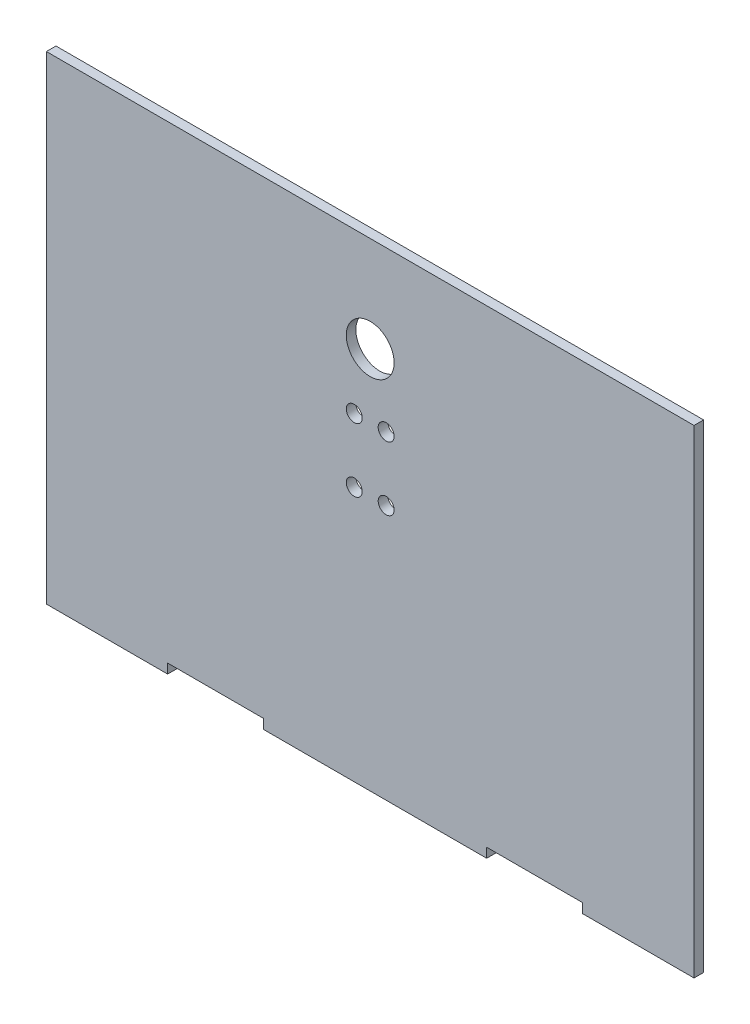
ISO-10303-21;
HEADER;
FILE_DESCRIPTION(('STEP AP214'),'2;1');
FILE_NAME('part.step','',(''),(''),'','','');
FILE_SCHEMA(('AUTOMOTIVE_DESIGN { 1 0 10303 214 1 1 1 1 }'));
ENDSEC;
DATA;
#1=APPLICATION_CONTEXT('core data for automotive mechanical design processes');
#2=APPLICATION_PROTOCOL_DEFINITION('international standard','automotive_design',2000,#1);
#3=PRODUCT_CONTEXT('',#1,'mechanical');
#4=PRODUCT('Part','Part','',(#3));
#5=PRODUCT_RELATED_PRODUCT_CATEGORY('part','',(#4));
#6=PRODUCT_DEFINITION_FORMATION('','',#4);
#7=PRODUCT_DEFINITION_CONTEXT('part definition',#1,'design');
#8=PRODUCT_DEFINITION('design','',#6,#7);
#9=PRODUCT_DEFINITION_SHAPE('','',#8);
#10=(LENGTH_UNIT() NAMED_UNIT(*) SI_UNIT(.MILLI.,.METRE.));
#11=(NAMED_UNIT(*) PLANE_ANGLE_UNIT() SI_UNIT($,.RADIAN.));
#12=(NAMED_UNIT(*) SI_UNIT($,.STERADIAN.) SOLID_ANGLE_UNIT());
#13=UNCERTAINTY_MEASURE_WITH_UNIT(LENGTH_MEASURE(1.E-05),#10,'distance_accuracy_value','');
#14=(GEOMETRIC_REPRESENTATION_CONTEXT(3) GLOBAL_UNCERTAINTY_ASSIGNED_CONTEXT((#13)) GLOBAL_UNIT_ASSIGNED_CONTEXT((#10,
#11,#12)) REPRESENTATION_CONTEXT('',''));
#15=CARTESIAN_POINT('',(0.,0.,0.));
#16=DIRECTION('',(0.,0.,1.));
#17=DIRECTION('',(1.,0.,0.));
#18=AXIS2_PLACEMENT_3D('',#15,#16,#17);
#19=CARTESIAN_POINT('',(-101.5,-75.,3.));
#20=DIRECTION('',(0.,1.,0.));
#21=DIRECTION('',(0.,0.,1.));
#22=AXIS2_PLACEMENT_3D('',#19,#20,#21);
#23=PLANE('',#22);
#24=DIRECTION('',(1.,0.,0.));
#25=VECTOR('',#24,1.);
#26=CARTESIAN_POINT('',(-101.5,-75.,0.));
#27=LINE('',#26,#25);
#28=CARTESIAN_POINT('',(-101.5,-75.,0.));
#29=VERTEX_POINT('',#28);
#30=CARTESIAN_POINT('',(-63.5,-75.,0.));
#31=VERTEX_POINT('',#30);
#32=EDGE_CURVE('E147',#29,#31,#27,.T.);
#33=ORIENTED_EDGE('',*,*,#32,.T.);
#34=DIRECTION('',(0.,0.,1.));
#35=VECTOR('',#34,1.);
#36=CARTESIAN_POINT('',(-63.5,-75.,-7.));
#37=LINE('',#36,#35);
#38=CARTESIAN_POINT('',(-63.5,-75.,3.));
#39=VERTEX_POINT('',#38);
#40=EDGE_CURVE('E130',#31,#39,#37,.T.);
#41=ORIENTED_EDGE('',*,*,#40,.T.);
#42=DIRECTION('',(1.,0.,0.));
#43=VECTOR('',#42,1.);
#44=CARTESIAN_POINT('',(-101.5,-75.,3.));
#45=LINE('',#44,#43);
#46=CARTESIAN_POINT('',(-101.5,-75.,3.));
#47=VERTEX_POINT('',#46);
#48=EDGE_CURVE('E145',#47,#39,#45,.T.);
#49=ORIENTED_EDGE('',*,*,#48,.F.);
#50=DIRECTION('',(0.,0.,-1.));
#51=VECTOR('',#50,1.);
#52=CARTESIAN_POINT('',(-101.5,-75.,3.));
#53=LINE('',#52,#51);
#54=EDGE_CURVE('E165',#47,#29,#53,.T.);
#55=ORIENTED_EDGE('',*,*,#54,.T.);
#56=EDGE_LOOP('',(#33,#41,#49,#55));
#57=FACE_BOUND('',#56,.T.);
#58=ADVANCED_FACE('F38',(#57),#23,.F.);
#59=CARTESIAN_POINT('',(-33.5,-75.,3.));
#60=VERTEX_POINT('',#59);
#61=CARTESIAN_POINT('',(36.5,-74.9999999999998,3.));
#62=VERTEX_POINT('',#61);
#63=EDGE_CURVE('E159',#60,#62,#45,.T.);
#64=ORIENTED_EDGE('',*,*,#63,.F.);
#65=DIRECTION('',(0.,0.,1.));
#66=VECTOR('',#65,1.);
#67=CARTESIAN_POINT('',(-33.5,-75.,-7.));
#68=LINE('',#67,#66);
#69=CARTESIAN_POINT('',(-33.5,-75.,0.));
#70=VERTEX_POINT('',#69);
#71=EDGE_CURVE('E149',#70,#60,#68,.T.);
#72=ORIENTED_EDGE('',*,*,#71,.F.);
#73=CARTESIAN_POINT('',(36.5,-74.9999999999998,0.));
#74=VERTEX_POINT('',#73);
#75=EDGE_CURVE('E249',#70,#74,#27,.T.);
#76=ORIENTED_EDGE('',*,*,#75,.T.);
#77=DIRECTION('',(0.,0.,1.));
#78=VECTOR('',#77,1.);
#79=CARTESIAN_POINT('',(36.5,-74.9999999999998,-7.));
#80=LINE('',#79,#78);
#81=EDGE_CURVE('E139',#74,#62,#80,.T.);
#82=ORIENTED_EDGE('',*,*,#81,.T.);
#83=EDGE_LOOP('',(#64,#72,#76,#82));
#84=FACE_BOUND('',#83,.T.);
#85=ADVANCED_FACE('F325',(#84),#23,.F.);
#86=CARTESIAN_POINT('',(101.5,75.,3.));
#87=DIRECTION('',(-1.,0.,0.));
#88=DIRECTION('',(0.,-1.,0.));
#89=AXIS2_PLACEMENT_3D('',#86,#87,#88);
#90=PLANE('',#89);
#91=DIRECTION('',(0.,1.,0.));
#92=VECTOR('',#91,1.);
#93=CARTESIAN_POINT('',(101.5,75.,0.));
#94=LINE('',#93,#92);
#95=CARTESIAN_POINT('',(101.5,-75.,0.));
#96=VERTEX_POINT('',#95);
#97=CARTESIAN_POINT('',(101.5,75.,0.));
#98=VERTEX_POINT('',#97);
#99=EDGE_CURVE('E269',#96,#98,#94,.T.);
#100=ORIENTED_EDGE('',*,*,#99,.T.);
#101=DIRECTION('',(0.,0.,-1.));
#102=VECTOR('',#101,1.);
#103=CARTESIAN_POINT('',(101.5,75.,3.));
#104=LINE('',#103,#102);
#105=CARTESIAN_POINT('',(101.5,75.,3.));
#106=VERTEX_POINT('',#105);
#107=EDGE_CURVE('E264',#106,#98,#104,.T.);
#108=ORIENTED_EDGE('',*,*,#107,.F.);
#109=DIRECTION('',(0.,1.,0.));
#110=VECTOR('',#109,1.);
#111=CARTESIAN_POINT('',(101.5,75.,3.));
#112=LINE('',#111,#110);
#113=CARTESIAN_POINT('',(101.5,-75.,3.));
#114=VERTEX_POINT('',#113);
#115=EDGE_CURVE('E178',#114,#106,#112,.T.);
#116=ORIENTED_EDGE('',*,*,#115,.F.);
#117=DIRECTION('',(0.,0.,-1.));
#118=VECTOR('',#117,1.);
#119=CARTESIAN_POINT('',(101.5,-75.,3.));
#120=LINE('',#119,#118);
#121=EDGE_CURVE('E158',#114,#96,#120,.T.);
#122=ORIENTED_EDGE('',*,*,#121,.T.);
#123=EDGE_LOOP('',(#100,#108,#116,#122));
#124=FACE_BOUND('',#123,.T.);
#125=ADVANCED_FACE('F40',(#124),#90,.F.);
#126=CARTESIAN_POINT('',(-101.5,75.,3.));
#127=DIRECTION('',(0.,-1.,0.));
#128=DIRECTION('',(0.,0.,-1.));
#129=AXIS2_PLACEMENT_3D('',#126,#127,#128);
#130=PLANE('',#129);
#131=DIRECTION('',(-1.,0.,0.));
#132=VECTOR('',#131,1.);
#133=CARTESIAN_POINT('',(-101.5,75.,0.));
#134=LINE('',#133,#132);
#135=CARTESIAN_POINT('',(-101.5,75.,0.));
#136=VERTEX_POINT('',#135);
#137=EDGE_CURVE('E300',#98,#136,#134,.T.);
#138=ORIENTED_EDGE('',*,*,#137,.T.);
#139=DIRECTION('',(0.,0.,-1.));
#140=VECTOR('',#139,1.);
#141=CARTESIAN_POINT('',(-101.5,75.,3.));
#142=LINE('',#141,#140);
#143=CARTESIAN_POINT('',(-101.5,75.,3.));
#144=VERTEX_POINT('',#143);
#145=EDGE_CURVE('E288',#144,#136,#142,.T.);
#146=ORIENTED_EDGE('',*,*,#145,.F.);
#147=DIRECTION('',(-1.,0.,0.));
#148=VECTOR('',#147,1.);
#149=CARTESIAN_POINT('',(-101.5,75.,3.));
#150=LINE('',#149,#148);
#151=EDGE_CURVE('E176',#106,#144,#150,.T.);
#152=ORIENTED_EDGE('',*,*,#151,.F.);
#153=ORIENTED_EDGE('',*,*,#107,.T.);
#154=EDGE_LOOP('',(#138,#146,#152,#153));
#155=FACE_BOUND('',#154,.T.);
#156=ADVANCED_FACE('F312',(#155),#130,.F.);
#157=CARTESIAN_POINT('',(-101.5,75.,3.));
#158=DIRECTION('',(1.,0.,0.));
#159=DIRECTION('',(0.,1.,0.));
#160=AXIS2_PLACEMENT_3D('',#157,#158,#159);
#161=PLANE('',#160);
#162=DIRECTION('',(0.,-1.,0.));
#163=VECTOR('',#162,1.);
#164=CARTESIAN_POINT('',(-101.5,75.,0.));
#165=LINE('',#164,#163);
#166=EDGE_CURVE('E297',#136,#29,#165,.T.);
#167=ORIENTED_EDGE('',*,*,#166,.T.);
#168=ORIENTED_EDGE('',*,*,#54,.F.);
#169=DIRECTION('',(0.,-1.,0.));
#170=VECTOR('',#169,1.);
#171=CARTESIAN_POINT('',(-101.5,75.,3.));
#172=LINE('',#171,#170);
#173=EDGE_CURVE('E155',#144,#47,#172,.T.);
#174=ORIENTED_EDGE('',*,*,#173,.F.);
#175=ORIENTED_EDGE('',*,*,#145,.T.);
#176=EDGE_LOOP('',(#167,#168,#174,#175));
#177=FACE_BOUND('',#176,.T.);
#178=ADVANCED_FACE('F314',(#177),#161,.F.);
#179=CARTESIAN_POINT('',(66.5,-74.9999999999998,3.));
#180=VERTEX_POINT('',#179);
#181=EDGE_CURVE('E161',#180,#114,#45,.T.);
#182=ORIENTED_EDGE('',*,*,#181,.F.);
#183=DIRECTION('',(0.,0.,1.));
#184=VECTOR('',#183,1.);
#185=CARTESIAN_POINT('',(66.5,-74.9999999999998,-7.));
#186=LINE('',#185,#184);
#187=CARTESIAN_POINT('',(66.5,-74.9999999999998,0.));
#188=VERTEX_POINT('',#187);
#189=EDGE_CURVE('E204',#188,#180,#186,.T.);
#190=ORIENTED_EDGE('',*,*,#189,.F.);
#191=EDGE_CURVE('E296',#188,#96,#27,.T.);
#192=ORIENTED_EDGE('',*,*,#191,.T.);
#193=ORIENTED_EDGE('',*,*,#121,.F.);
#194=EDGE_LOOP('',(#182,#190,#192,#193));
#195=FACE_BOUND('',#194,.T.);
#196=ADVANCED_FACE('F316',(#195),#23,.F.);
#197=CARTESIAN_POINT('',(0.,0.,3.));
#198=DIRECTION('',(0.,0.,1.));
#199=DIRECTION('',(1.,0.,0.));
#200=AXIS2_PLACEMENT_3D('',#197,#198,#199);
#201=PLANE('',#200);
#202=DIRECTION('',(0.,-1.,0.));
#203=VECTOR('',#202,1.);
#204=CARTESIAN_POINT('',(-63.5,-75.,3.));
#205=LINE('',#204,#203);
#206=CARTESIAN_POINT('',(-63.5,-72.0000000000002,3.));
#207=VERTEX_POINT('',#206);
#208=EDGE_CURVE('E127',#207,#39,#205,.T.);
#209=ORIENTED_EDGE('',*,*,#208,.F.);
#210=DIRECTION('',(-1.,0.,0.));
#211=VECTOR('',#210,1.);
#212=CARTESIAN_POINT('',(-63.5,-72.0000000000002,3.));
#213=LINE('',#212,#211);
#214=CARTESIAN_POINT('',(-33.5,-72.0000000000002,3.));
#215=VERTEX_POINT('',#214);
#216=EDGE_CURVE('E150',#215,#207,#213,.T.);
#217=ORIENTED_EDGE('',*,*,#216,.F.);
#218=DIRECTION('',(0.,1.,0.));
#219=VECTOR('',#218,1.);
#220=CARTESIAN_POINT('',(-33.5,-75.,3.));
#221=LINE('',#220,#219);
#222=EDGE_CURVE('E138',#60,#215,#221,.T.);
#223=ORIENTED_EDGE('',*,*,#222,.F.);
#224=ORIENTED_EDGE('',*,*,#63,.T.);
#225=DIRECTION('',(0.,-1.,0.));
#226=VECTOR('',#225,1.);
#227=CARTESIAN_POINT('',(36.5,-74.9999999999998,3.));
#228=LINE('',#227,#226);
#229=CARTESIAN_POINT('',(36.5,-72.,3.));
#230=VERTEX_POINT('',#229);
#231=EDGE_CURVE('E207',#230,#62,#228,.T.);
#232=ORIENTED_EDGE('',*,*,#231,.F.);
#233=DIRECTION('',(-1.,0.,0.));
#234=VECTOR('',#233,1.);
#235=CARTESIAN_POINT('',(36.5,-72.,3.));
#236=LINE('',#235,#234);
#237=CARTESIAN_POINT('',(66.5,-72.,3.));
#238=VERTEX_POINT('',#237);
#239=EDGE_CURVE('E218',#238,#230,#236,.T.);
#240=ORIENTED_EDGE('',*,*,#239,.F.);
#241=DIRECTION('',(0.,1.,0.));
#242=VECTOR('',#241,1.);
#243=CARTESIAN_POINT('',(66.5,-74.9999999999998,3.));
#244=LINE('',#243,#242);
#245=EDGE_CURVE('E222',#180,#238,#244,.T.);
#246=ORIENTED_EDGE('',*,*,#245,.F.);
#247=ORIENTED_EDGE('',*,*,#181,.T.);
#248=ORIENTED_EDGE('',*,*,#115,.T.);
#249=ORIENTED_EDGE('',*,*,#151,.T.);
#250=ORIENTED_EDGE('',*,*,#173,.T.);
#251=ORIENTED_EDGE('',*,*,#48,.T.);
#252=EDGE_LOOP('',(#209,#217,#223,#224,#232,#240,#246,#247,#248,#249,#250,#251));
#253=FACE_BOUND('',#252,.T.);
#254=CARTESIAN_POINT('',(0.,45.,3.));
#255=DIRECTION('',(0.,0.,1.));
#256=DIRECTION('',(1.,0.,0.));
#257=AXIS2_PLACEMENT_3D('',#254,#255,#256);
#258=CIRCLE('',#257,7.5);
#259=CARTESIAN_POINT('',(7.5,45.,3.));
#260=VERTEX_POINT('',#259);
#261=EDGE_CURVE('E199',#260,#260,#258,.T.);
#262=ORIENTED_EDGE('',*,*,#261,.F.);
#263=EDGE_LOOP('',(#262));
#264=FACE_BOUND('',#263,.T.);
#265=CARTESIAN_POINT('',(-5.,25.,3.));
#266=DIRECTION('',(0.,0.,1.));
#267=DIRECTION('',(1.,0.,0.));
#268=AXIS2_PLACEMENT_3D('',#265,#266,#267);
#269=CIRCLE('',#268,2.5);
#270=CARTESIAN_POINT('',(-2.5,25.,3.));
#271=VERTEX_POINT('',#270);
#272=EDGE_CURVE('E195',#271,#271,#269,.T.);
#273=ORIENTED_EDGE('',*,*,#272,.F.);
#274=EDGE_LOOP('',(#273));
#275=FACE_BOUND('',#274,.T.);
#276=CARTESIAN_POINT('',(-5.,5.,3.));
#277=DIRECTION('',(0.,0.,1.));
#278=DIRECTION('',(1.,0.,0.));
#279=AXIS2_PLACEMENT_3D('',#276,#277,#278);
#280=CIRCLE('',#279,2.5);
#281=CARTESIAN_POINT('',(-2.5,5.,3.));
#282=VERTEX_POINT('',#281);
#283=EDGE_CURVE('E191',#282,#282,#280,.T.);
#284=ORIENTED_EDGE('',*,*,#283,.F.);
#285=EDGE_LOOP('',(#284));
#286=FACE_BOUND('',#285,.T.);
#287=CARTESIAN_POINT('',(5.,5.,3.));
#288=DIRECTION('',(0.,0.,1.));
#289=DIRECTION('',(-1.,0.,0.));
#290=AXIS2_PLACEMENT_3D('',#287,#288,#289);
#291=CIRCLE('',#290,2.5);
#292=CARTESIAN_POINT('',(2.5,5.,3.));
#293=VERTEX_POINT('',#292);
#294=EDGE_CURVE('E187',#293,#293,#291,.T.);
#295=ORIENTED_EDGE('',*,*,#294,.F.);
#296=EDGE_LOOP('',(#295));
#297=FACE_BOUND('',#296,.T.);
#298=CARTESIAN_POINT('',(5.00000000000001,25.,3.));
#299=DIRECTION('',(0.,0.,1.));
#300=DIRECTION('',(-1.,0.,0.));
#301=AXIS2_PLACEMENT_3D('',#298,#299,#300);
#302=CIRCLE('',#301,2.5);
#303=CARTESIAN_POINT('',(2.50000000000001,25.,3.));
#304=VERTEX_POINT('',#303);
#305=EDGE_CURVE('E183',#304,#304,#302,.T.);
#306=ORIENTED_EDGE('',*,*,#305,.F.);
#307=EDGE_LOOP('',(#306));
#308=FACE_BOUND('',#307,.T.);
#309=ADVANCED_FACE('F152',(#253,#264,#275,#286,#297,#308),#201,.T.);
#310=CARTESIAN_POINT('',(0.,0.,0.));
#311=DIRECTION('',(0.,0.,1.));
#312=DIRECTION('',(1.,0.,0.));
#313=AXIS2_PLACEMENT_3D('',#310,#311,#312);
#314=PLANE('',#313);
#315=CARTESIAN_POINT('',(0.,45.,0.));
#316=DIRECTION('',(0.,0.,1.));
#317=DIRECTION('',(1.,0.,0.));
#318=AXIS2_PLACEMENT_3D('',#315,#316,#317);
#319=CIRCLE('',#318,7.5);
#320=CARTESIAN_POINT('',(7.5,45.,0.));
#321=VERTEX_POINT('',#320);
#322=EDGE_CURVE('E265',#321,#321,#319,.T.);
#323=ORIENTED_EDGE('',*,*,#322,.T.);
#324=EDGE_LOOP('',(#323));
#325=FACE_BOUND('',#324,.T.);
#326=CARTESIAN_POINT('',(-5.,25.,0.));
#327=DIRECTION('',(0.,0.,1.));
#328=DIRECTION('',(1.,0.,0.));
#329=AXIS2_PLACEMENT_3D('',#326,#327,#328);
#330=CIRCLE('',#329,2.5);
#331=CARTESIAN_POINT('',(-2.5,25.,0.));
#332=VERTEX_POINT('',#331);
#333=EDGE_CURVE('E270',#332,#332,#330,.T.);
#334=ORIENTED_EDGE('',*,*,#333,.T.);
#335=EDGE_LOOP('',(#334));
#336=FACE_BOUND('',#335,.T.);
#337=CARTESIAN_POINT('',(-5.,5.,0.));
#338=DIRECTION('',(0.,0.,1.));
#339=DIRECTION('',(1.,0.,0.));
#340=AXIS2_PLACEMENT_3D('',#337,#338,#339);
#341=CIRCLE('',#340,2.5);
#342=CARTESIAN_POINT('',(-2.5,5.,0.));
#343=VERTEX_POINT('',#342);
#344=EDGE_CURVE('E274',#343,#343,#341,.T.);
#345=ORIENTED_EDGE('',*,*,#344,.T.);
#346=EDGE_LOOP('',(#345));
#347=FACE_BOUND('',#346,.T.);
#348=CARTESIAN_POINT('',(5.,5.,0.));
#349=DIRECTION('',(0.,0.,1.));
#350=DIRECTION('',(1.,0.,0.));
#351=AXIS2_PLACEMENT_3D('',#348,#349,#350);
#352=CIRCLE('',#351,2.5);
#353=CARTESIAN_POINT('',(7.5,5.,0.));
#354=VERTEX_POINT('',#353);
#355=EDGE_CURVE('E278',#354,#354,#352,.T.);
#356=ORIENTED_EDGE('',*,*,#355,.T.);
#357=EDGE_LOOP('',(#356));
#358=FACE_BOUND('',#357,.T.);
#359=CARTESIAN_POINT('',(5.00000000000001,25.,0.));
#360=DIRECTION('',(0.,0.,1.));
#361=DIRECTION('',(1.,0.,0.));
#362=AXIS2_PLACEMENT_3D('',#359,#360,#361);
#363=CIRCLE('',#362,2.5);
#364=CARTESIAN_POINT('',(7.50000000000001,25.,0.));
#365=VERTEX_POINT('',#364);
#366=EDGE_CURVE('E203',#365,#365,#363,.T.);
#367=ORIENTED_EDGE('',*,*,#366,.T.);
#368=EDGE_LOOP('',(#367));
#369=FACE_BOUND('',#368,.T.);
#370=DIRECTION('',(-1.,0.,0.));
#371=VECTOR('',#370,1.);
#372=CARTESIAN_POINT('',(0.,-72.0000000000002,0.));
#373=LINE('',#372,#371);
#374=CARTESIAN_POINT('',(-33.5,-72.0000000000002,0.));
#375=VERTEX_POINT('',#374);
#376=CARTESIAN_POINT('',(-63.5,-72.0000000000002,0.));
#377=VERTEX_POINT('',#376);
#378=EDGE_CURVE('E47',#375,#377,#373,.T.);
#379=ORIENTED_EDGE('',*,*,#378,.T.);
#380=DIRECTION('',(0.,-1.,0.));
#381=VECTOR('',#380,1.);
#382=CARTESIAN_POINT('',(-63.5,0.,0.));
#383=LINE('',#382,#381);
#384=EDGE_CURVE('E11',#377,#31,#383,.T.);
#385=ORIENTED_EDGE('',*,*,#384,.T.);
#386=ORIENTED_EDGE('',*,*,#32,.F.);
#387=ORIENTED_EDGE('',*,*,#166,.F.);
#388=ORIENTED_EDGE('',*,*,#137,.F.);
#389=ORIENTED_EDGE('',*,*,#99,.F.);
#390=ORIENTED_EDGE('',*,*,#191,.F.);
#391=DIRECTION('',(0.,1.,0.));
#392=VECTOR('',#391,1.);
#393=CARTESIAN_POINT('',(66.4999999999996,3.07624296406569E-13,0.));
#394=LINE('',#393,#392);
#395=CARTESIAN_POINT('',(66.5,-72.,0.));
#396=VERTEX_POINT('',#395);
#397=EDGE_CURVE('E260',#188,#396,#394,.T.);
#398=ORIENTED_EDGE('',*,*,#397,.T.);
#399=DIRECTION('',(-1.,0.,0.));
#400=VECTOR('',#399,1.);
#401=CARTESIAN_POINT('',(0.,-72.,0.));
#402=LINE('',#401,#400);
#403=CARTESIAN_POINT('',(36.5,-72.,0.));
#404=VERTEX_POINT('',#403);
#405=EDGE_CURVE('E254',#396,#404,#402,.T.);
#406=ORIENTED_EDGE('',*,*,#405,.T.);
#407=DIRECTION('',(0.,-1.,0.));
#408=VECTOR('',#407,1.);
#409=CARTESIAN_POINT('',(36.5,0.,0.));
#410=LINE('',#409,#408);
#411=EDGE_CURVE('E251',#404,#74,#410,.T.);
#412=ORIENTED_EDGE('',*,*,#411,.T.);
#413=ORIENTED_EDGE('',*,*,#75,.F.);
#414=DIRECTION('',(0.,1.,0.));
#415=VECTOR('',#414,1.);
#416=CARTESIAN_POINT('',(-33.5000000000004,-1.54968630520605E-13,0.));
#417=LINE('',#416,#415);
#418=EDGE_CURVE('E244',#70,#375,#417,.T.);
#419=ORIENTED_EDGE('',*,*,#418,.T.);
#420=EDGE_LOOP('',(#379,#385,#386,#387,#388,#389,#390,#398,#406,#412,#413,#419));
#421=FACE_BOUND('',#420,.T.);
#422=ADVANCED_FACE('F246',(#325,#336,#347,#358,#369,#421),#314,.F.);
#423=CARTESIAN_POINT('',(5.00000000000001,25.,-7.));
#424=DIRECTION('',(0.,0.,1.));
#425=DIRECTION('',(1.,0.,0.));
#426=AXIS2_PLACEMENT_3D('',#423,#424,#425);
#427=CYLINDRICAL_SURFACE('',#426,2.5);
#428=ORIENTED_EDGE('',*,*,#305,.T.);
#429=EDGE_LOOP('',(#428));
#430=FACE_BOUND('',#429,.T.);
#431=ORIENTED_EDGE('',*,*,#366,.F.);
#432=EDGE_LOOP('',(#431));
#433=FACE_BOUND('',#432,.T.);
#434=ADVANCED_FACE('F335',(#430,#433),#427,.F.);
#435=CARTESIAN_POINT('',(5.,5.,-7.));
#436=DIRECTION('',(0.,0.,1.));
#437=DIRECTION('',(1.,0.,0.));
#438=AXIS2_PLACEMENT_3D('',#435,#436,#437);
#439=CYLINDRICAL_SURFACE('',#438,2.5);
#440=ORIENTED_EDGE('',*,*,#294,.T.);
#441=EDGE_LOOP('',(#440));
#442=FACE_BOUND('',#441,.T.);
#443=ORIENTED_EDGE('',*,*,#355,.F.);
#444=EDGE_LOOP('',(#443));
#445=FACE_BOUND('',#444,.T.);
#446=ADVANCED_FACE('F341',(#442,#445),#439,.F.);
#447=CARTESIAN_POINT('',(-5.,5.,-7.));
#448=DIRECTION('',(0.,0.,1.));
#449=DIRECTION('',(1.,0.,0.));
#450=AXIS2_PLACEMENT_3D('',#447,#448,#449);
#451=CYLINDRICAL_SURFACE('',#450,2.5);
#452=ORIENTED_EDGE('',*,*,#283,.T.);
#453=EDGE_LOOP('',(#452));
#454=FACE_BOUND('',#453,.T.);
#455=ORIENTED_EDGE('',*,*,#344,.F.);
#456=EDGE_LOOP('',(#455));
#457=FACE_BOUND('',#456,.T.);
#458=ADVANCED_FACE('F345',(#454,#457),#451,.F.);
#459=CARTESIAN_POINT('',(-5.,25.,-7.));
#460=DIRECTION('',(0.,0.,1.));
#461=DIRECTION('',(1.,0.,0.));
#462=AXIS2_PLACEMENT_3D('',#459,#460,#461);
#463=CYLINDRICAL_SURFACE('',#462,2.5);
#464=ORIENTED_EDGE('',*,*,#272,.T.);
#465=EDGE_LOOP('',(#464));
#466=FACE_BOUND('',#465,.T.);
#467=ORIENTED_EDGE('',*,*,#333,.F.);
#468=EDGE_LOOP('',(#467));
#469=FACE_BOUND('',#468,.T.);
#470=ADVANCED_FACE('F349',(#466,#469),#463,.F.);
#471=CARTESIAN_POINT('',(0.,45.,-7.));
#472=DIRECTION('',(0.,0.,1.));
#473=DIRECTION('',(1.,0.,0.));
#474=AXIS2_PLACEMENT_3D('',#471,#472,#473);
#475=CYLINDRICAL_SURFACE('',#474,7.5);
#476=ORIENTED_EDGE('',*,*,#261,.T.);
#477=EDGE_LOOP('',(#476));
#478=FACE_BOUND('',#477,.T.);
#479=ORIENTED_EDGE('',*,*,#322,.F.);
#480=EDGE_LOOP('',(#479));
#481=FACE_BOUND('',#480,.T.);
#482=ADVANCED_FACE('F353',(#478,#481),#475,.F.);
#483=CARTESIAN_POINT('',(36.5,-74.9999999999998,-7.));
#484=DIRECTION('',(-1.,0.,0.));
#485=DIRECTION('',(0.,0.,1.));
#486=AXIS2_PLACEMENT_3D('',#483,#484,#485);
#487=PLANE('',#486);
#488=DIRECTION('',(0.,0.,1.));
#489=VECTOR('',#488,1.);
#490=CARTESIAN_POINT('',(36.5,-72.,-7.));
#491=LINE('',#490,#489);
#492=EDGE_CURVE('E210',#404,#230,#491,.T.);
#493=ORIENTED_EDGE('',*,*,#492,.T.);
#494=ORIENTED_EDGE('',*,*,#231,.T.);
#495=ORIENTED_EDGE('',*,*,#81,.F.);
#496=ORIENTED_EDGE('',*,*,#411,.F.);
#497=EDGE_LOOP('',(#493,#494,#495,#496));
#498=FACE_BOUND('',#497,.T.);
#499=ADVANCED_FACE('F357',(#498),#487,.F.);
#500=CARTESIAN_POINT('',(36.5,-72.,-7.));
#501=DIRECTION('',(0.,1.,0.));
#502=DIRECTION('',(0.,0.,1.));
#503=AXIS2_PLACEMENT_3D('',#500,#501,#502);
#504=PLANE('',#503);
#505=DIRECTION('',(0.,0.,1.));
#506=VECTOR('',#505,1.);
#507=CARTESIAN_POINT('',(66.5,-72.,-7.));
#508=LINE('',#507,#506);
#509=EDGE_CURVE('E62',#396,#238,#508,.T.);
#510=ORIENTED_EDGE('',*,*,#509,.T.);
#511=ORIENTED_EDGE('',*,*,#239,.T.);
#512=ORIENTED_EDGE('',*,*,#492,.F.);
#513=ORIENTED_EDGE('',*,*,#405,.F.);
#514=EDGE_LOOP('',(#510,#511,#512,#513));
#515=FACE_BOUND('',#514,.T.);
#516=ADVANCED_FACE('F362',(#515),#504,.F.);
#517=CARTESIAN_POINT('',(66.5,-74.9999999999998,-7.));
#518=DIRECTION('',(1.,0.,0.));
#519=DIRECTION('',(0.,1.,0.));
#520=AXIS2_PLACEMENT_3D('',#517,#518,#519);
#521=PLANE('',#520);
#522=ORIENTED_EDGE('',*,*,#189,.T.);
#523=ORIENTED_EDGE('',*,*,#245,.T.);
#524=ORIENTED_EDGE('',*,*,#509,.F.);
#525=ORIENTED_EDGE('',*,*,#397,.F.);
#526=EDGE_LOOP('',(#522,#523,#524,#525));
#527=FACE_BOUND('',#526,.T.);
#528=ADVANCED_FACE('F359',(#527),#521,.F.);
#529=CARTESIAN_POINT('',(-63.5,-75.,-7.));
#530=DIRECTION('',(-1.,0.,0.));
#531=DIRECTION('',(0.,0.,1.));
#532=AXIS2_PLACEMENT_3D('',#529,#530,#531);
#533=PLANE('',#532);
#534=DIRECTION('',(0.,0.,1.));
#535=VECTOR('',#534,1.);
#536=CARTESIAN_POINT('',(-63.5,-72.0000000000002,-7.));
#537=LINE('',#536,#535);
#538=EDGE_CURVE('E132',#377,#207,#537,.T.);
#539=ORIENTED_EDGE('',*,*,#538,.T.);
#540=ORIENTED_EDGE('',*,*,#208,.T.);
#541=ORIENTED_EDGE('',*,*,#40,.F.);
#542=ORIENTED_EDGE('',*,*,#384,.F.);
#543=EDGE_LOOP('',(#539,#540,#541,#542));
#544=FACE_BOUND('',#543,.T.);
#545=ADVANCED_FACE('F129',(#544),#533,.F.);
#546=CARTESIAN_POINT('',(-63.5,-72.0000000000002,-7.));
#547=DIRECTION('',(0.,1.,0.));
#548=DIRECTION('',(0.,0.,1.));
#549=AXIS2_PLACEMENT_3D('',#546,#547,#548);
#550=PLANE('',#549);
#551=DIRECTION('',(0.,0.,1.));
#552=VECTOR('',#551,1.);
#553=CARTESIAN_POINT('',(-33.5,-72.0000000000002,-7.));
#554=LINE('',#553,#552);
#555=EDGE_CURVE('E54',#375,#215,#554,.T.);
#556=ORIENTED_EDGE('',*,*,#555,.T.);
#557=ORIENTED_EDGE('',*,*,#216,.T.);
#558=ORIENTED_EDGE('',*,*,#538,.F.);
#559=ORIENTED_EDGE('',*,*,#378,.F.);
#560=EDGE_LOOP('',(#556,#557,#558,#559));
#561=FACE_BOUND('',#560,.T.);
#562=ADVANCED_FACE('F239',(#561),#550,.F.);
#563=CARTESIAN_POINT('',(-33.5,-75.,-7.));
#564=DIRECTION('',(1.,0.,0.));
#565=DIRECTION('',(0.,1.,0.));
#566=AXIS2_PLACEMENT_3D('',#563,#564,#565);
#567=PLANE('',#566);
#568=ORIENTED_EDGE('',*,*,#71,.T.);
#569=ORIENTED_EDGE('',*,*,#222,.T.);
#570=ORIENTED_EDGE('',*,*,#555,.F.);
#571=ORIENTED_EDGE('',*,*,#418,.F.);
#572=EDGE_LOOP('',(#568,#569,#570,#571));
#573=FACE_BOUND('',#572,.T.);
#574=ADVANCED_FACE('F235',(#573),#567,.F.);
#575=CLOSED_SHELL('',(#58,#85,#125,#156,#178,#196,#309,#422,#434,#446,#458,#470,#482,#499,#516,
#528,#545,#562,#574));
#576=MANIFOLD_SOLID_BREP('B2',#575);
#577=ADVANCED_BREP_SHAPE_REPRESENTATION('',(#18,#576),#14);
#578=SHAPE_DEFINITION_REPRESENTATION(#9,#577);
ENDSEC;
END-ISO-10303-21;
